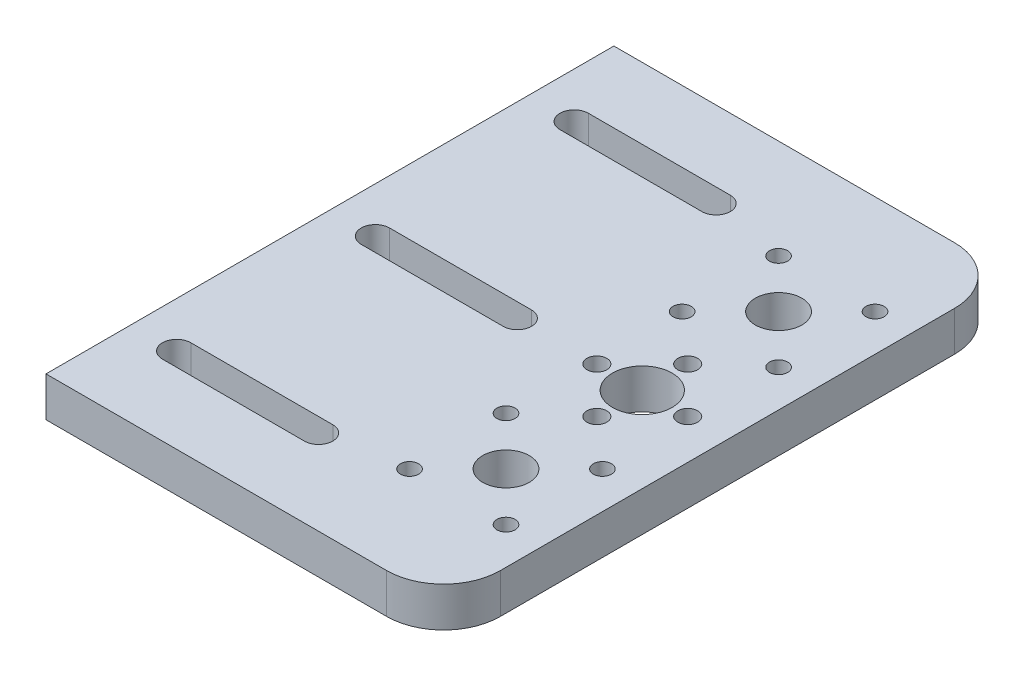
ISO-10303-21;
HEADER;
FILE_DESCRIPTION(('STEP AP214'),'2;1');
FILE_NAME('part.step','',(''),(''),'','','');
FILE_SCHEMA(('AUTOMOTIVE_DESIGN { 1 0 10303 214 1 1 1 1 }'));
ENDSEC;
DATA;
#1=APPLICATION_CONTEXT('core data for automotive mechanical design processes');
#2=APPLICATION_PROTOCOL_DEFINITION('international standard','automotive_design',2000,#1);
#3=PRODUCT_CONTEXT('',#1,'mechanical');
#4=PRODUCT('Part','Part','',(#3));
#5=PRODUCT_RELATED_PRODUCT_CATEGORY('part','',(#4));
#6=PRODUCT_DEFINITION_FORMATION('','',#4);
#7=PRODUCT_DEFINITION_CONTEXT('part definition',#1,'design');
#8=PRODUCT_DEFINITION('design','',#6,#7);
#9=PRODUCT_DEFINITION_SHAPE('','',#8);
#10=(LENGTH_UNIT() NAMED_UNIT(*) SI_UNIT(.MILLI.,.METRE.));
#11=(NAMED_UNIT(*) PLANE_ANGLE_UNIT() SI_UNIT($,.RADIAN.));
#12=(NAMED_UNIT(*) SI_UNIT($,.STERADIAN.) SOLID_ANGLE_UNIT());
#13=UNCERTAINTY_MEASURE_WITH_UNIT(LENGTH_MEASURE(1.E-05),#10,'distance_accuracy_value','');
#14=(GEOMETRIC_REPRESENTATION_CONTEXT(3) GLOBAL_UNCERTAINTY_ASSIGNED_CONTEXT((#13)) GLOBAL_UNIT_ASSIGNED_CONTEXT((#10,
#11,#12)) REPRESENTATION_CONTEXT('',''));
#15=CARTESIAN_POINT('',(0.,0.,0.));
#16=DIRECTION('',(0.,0.,1.));
#17=DIRECTION('',(1.,0.,0.));
#18=AXIS2_PLACEMENT_3D('',#15,#16,#17);
#19=CARTESIAN_POINT('',(0.,7.,-17.5));
#20=DIRECTION('',(0.,0.,-1.));
#21=DIRECTION('',(-1.,0.,0.));
#22=AXIS2_PLACEMENT_3D('',#19,#20,#21);
#23=PLANE('',#22);
#24=DIRECTION('',(1.,0.,0.));
#25=VECTOR('',#24,1.);
#26=CARTESIAN_POINT('',(0.,0.,-17.5));
#27=LINE('',#26,#25);
#28=CARTESIAN_POINT('',(7.99999999999999,0.,-17.5));
#29=VERTEX_POINT('',#28);
#30=CARTESIAN_POINT('',(33.,0.,-17.5));
#31=VERTEX_POINT('',#30);
#32=EDGE_CURVE('E334',#29,#31,#27,.T.);
#33=ORIENTED_EDGE('',*,*,#32,.T.);
#34=DIRECTION('',(0.,-1.,0.));
#35=VECTOR('',#34,1.);
#36=CARTESIAN_POINT('',(33.,7.,-17.5));
#37=LINE('',#36,#35);
#38=CARTESIAN_POINT('',(33.,7.,-17.5));
#39=VERTEX_POINT('',#38);
#40=EDGE_CURVE('E354',#39,#31,#37,.T.);
#41=ORIENTED_EDGE('',*,*,#40,.F.);
#42=DIRECTION('',(1.,0.,0.));
#43=VECTOR('',#42,1.);
#44=CARTESIAN_POINT('',(0.,7.,-17.5));
#45=LINE('',#44,#43);
#46=CARTESIAN_POINT('',(7.99999999999999,7.,-17.5));
#47=VERTEX_POINT('',#46);
#48=EDGE_CURVE('E247',#47,#39,#45,.T.);
#49=ORIENTED_EDGE('',*,*,#48,.F.);
#50=DIRECTION('',(0.,-1.,0.));
#51=VECTOR('',#50,1.);
#52=CARTESIAN_POINT('',(7.99999999999999,7.,-17.5));
#53=LINE('',#52,#51);
#54=EDGE_CURVE('E346',#47,#29,#53,.T.);
#55=ORIENTED_EDGE('',*,*,#54,.T.);
#56=EDGE_LOOP('',(#33,#41,#49,#55));
#57=FACE_BOUND('',#56,.T.);
#58=ADVANCED_FACE('F41',(#57),#23,.F.);
#59=CARTESIAN_POINT('',(33.,7.,-15.));
#60=DIRECTION('',(0.,-1.,0.));
#61=DIRECTION('',(0.,0.,-1.));
#62=AXIS2_PLACEMENT_3D('',#59,#60,#61);
#63=CYLINDRICAL_SURFACE('',#62,2.5);
#64=CARTESIAN_POINT('',(33.,0.,-15.));
#65=DIRECTION('',(0.,1.,0.));
#66=DIRECTION('',(0.,0.,1.));
#67=AXIS2_PLACEMENT_3D('',#64,#65,#66);
#68=CIRCLE('',#67,2.5);
#69=CARTESIAN_POINT('',(33.,0.,-12.5));
#70=VERTEX_POINT('',#69);
#71=EDGE_CURVE('E337',#31,#70,#68,.F.);
#72=ORIENTED_EDGE('',*,*,#71,.T.);
#73=DIRECTION('',(0.,-1.,0.));
#74=VECTOR('',#73,1.);
#75=CARTESIAN_POINT('',(33.,7.,-12.5));
#76=LINE('',#75,#74);
#77=CARTESIAN_POINT('',(33.,7.,-12.5));
#78=VERTEX_POINT('',#77);
#79=EDGE_CURVE('E352',#78,#70,#76,.T.);
#80=ORIENTED_EDGE('',*,*,#79,.F.);
#81=CARTESIAN_POINT('',(33.,7.,-15.));
#82=DIRECTION('',(0.,1.,0.));
#83=DIRECTION('',(0.,0.,1.));
#84=AXIS2_PLACEMENT_3D('',#81,#82,#83);
#85=CIRCLE('',#84,2.5);
#86=EDGE_CURVE('E250',#39,#78,#85,.F.);
#87=ORIENTED_EDGE('',*,*,#86,.F.);
#88=ORIENTED_EDGE('',*,*,#40,.T.);
#89=EDGE_LOOP('',(#72,#80,#87,#88));
#90=FACE_BOUND('',#89,.T.);
#91=ADVANCED_FACE('F445',(#90),#63,.F.);
#92=CARTESIAN_POINT('',(0.,7.,-12.5));
#93=DIRECTION('',(0.,0.,-1.));
#94=DIRECTION('',(-1.,0.,0.));
#95=AXIS2_PLACEMENT_3D('',#92,#93,#94);
#96=PLANE('',#95);
#97=DIRECTION('',(1.,0.,0.));
#98=VECTOR('',#97,1.);
#99=CARTESIAN_POINT('',(0.,0.,-12.5));
#100=LINE('',#99,#98);
#101=CARTESIAN_POINT('',(7.99999999999999,0.,-12.5));
#102=VERTEX_POINT('',#101);
#103=EDGE_CURVE('E340',#102,#70,#100,.T.);
#104=ORIENTED_EDGE('',*,*,#103,.F.);
#105=DIRECTION('',(0.,-1.,0.));
#106=VECTOR('',#105,1.);
#107=CARTESIAN_POINT('',(7.99999999999999,7.,-12.5));
#108=LINE('',#107,#106);
#109=CARTESIAN_POINT('',(7.99999999999999,7.,-12.5));
#110=VERTEX_POINT('',#109);
#111=EDGE_CURVE('E349',#110,#102,#108,.T.);
#112=ORIENTED_EDGE('',*,*,#111,.F.);
#113=DIRECTION('',(1.,0.,0.));
#114=VECTOR('',#113,1.);
#115=CARTESIAN_POINT('',(0.,7.,-12.5));
#116=LINE('',#115,#114);
#117=EDGE_CURVE('E252',#110,#78,#116,.T.);
#118=ORIENTED_EDGE('',*,*,#117,.T.);
#119=ORIENTED_EDGE('',*,*,#79,.T.);
#120=EDGE_LOOP('',(#104,#112,#118,#119));
#121=FACE_BOUND('',#120,.T.);
#122=ADVANCED_FACE('F451',(#121),#96,.T.);
#123=CARTESIAN_POINT('',(33.,7.,-50.));
#124=DIRECTION('',(0.,-1.,0.));
#125=DIRECTION('',(0.,0.,-1.));
#126=AXIS2_PLACEMENT_3D('',#123,#124,#125);
#127=CYLINDRICAL_SURFACE('',#126,2.5);
#128=CARTESIAN_POINT('',(33.,0.,-50.));
#129=DIRECTION('',(0.,1.,0.));
#130=DIRECTION('',(0.,0.,1.));
#131=AXIS2_PLACEMENT_3D('',#128,#129,#130);
#132=CIRCLE('',#131,2.5);
#133=CARTESIAN_POINT('',(33.,0.,-47.5));
#134=VERTEX_POINT('',#133);
#135=CARTESIAN_POINT('',(33.,0.,-52.5));
#136=VERTEX_POINT('',#135);
#137=EDGE_CURVE('E295',#134,#136,#132,.T.);
#138=ORIENTED_EDGE('',*,*,#137,.F.);
#139=DIRECTION('',(0.,-1.,0.));
#140=VECTOR('',#139,1.);
#141=CARTESIAN_POINT('',(33.,7.,-47.5));
#142=LINE('',#141,#140);
#143=CARTESIAN_POINT('',(33.,7.,-47.5));
#144=VERTEX_POINT('',#143);
#145=EDGE_CURVE('E350',#144,#134,#142,.T.);
#146=ORIENTED_EDGE('',*,*,#145,.F.);
#147=CARTESIAN_POINT('',(33.,7.,-50.));
#148=DIRECTION('',(0.,1.,0.));
#149=DIRECTION('',(0.,0.,1.));
#150=AXIS2_PLACEMENT_3D('',#147,#148,#149);
#151=CIRCLE('',#150,2.5);
#152=CARTESIAN_POINT('',(33.,7.,-52.5));
#153=VERTEX_POINT('',#152);
#154=EDGE_CURVE('E209',#144,#153,#151,.T.);
#155=ORIENTED_EDGE('',*,*,#154,.T.);
#156=DIRECTION('',(0.,-1.,0.));
#157=VECTOR('',#156,1.);
#158=CARTESIAN_POINT('',(33.,7.,-52.5));
#159=LINE('',#158,#157);
#160=EDGE_CURVE('E358',#153,#136,#159,.T.);
#161=ORIENTED_EDGE('',*,*,#160,.T.);
#162=EDGE_LOOP('',(#138,#146,#155,#161));
#163=FACE_BOUND('',#162,.T.);
#164=ADVANCED_FACE('F505',(#163),#127,.F.);
#165=CARTESIAN_POINT('',(0.,7.,-47.5));
#166=DIRECTION('',(0.,0.,-1.));
#167=DIRECTION('',(-1.,0.,0.));
#168=AXIS2_PLACEMENT_3D('',#165,#166,#167);
#169=PLANE('',#168);
#170=DIRECTION('',(1.,0.,0.));
#171=VECTOR('',#170,1.);
#172=CARTESIAN_POINT('',(0.,0.,-47.5));
#173=LINE('',#172,#171);
#174=CARTESIAN_POINT('',(8.,0.,-47.5));
#175=VERTEX_POINT('',#174);
#176=EDGE_CURVE('E298',#175,#134,#173,.T.);
#177=ORIENTED_EDGE('',*,*,#176,.F.);
#178=DIRECTION('',(0.,-1.,0.));
#179=VECTOR('',#178,1.);
#180=CARTESIAN_POINT('',(8.,7.,-47.5));
#181=LINE('',#180,#179);
#182=CARTESIAN_POINT('',(8.,7.,-47.5));
#183=VERTEX_POINT('',#182);
#184=EDGE_CURVE('E363',#183,#175,#181,.T.);
#185=ORIENTED_EDGE('',*,*,#184,.F.);
#186=DIRECTION('',(1.,0.,0.));
#187=VECTOR('',#186,1.);
#188=CARTESIAN_POINT('',(0.,7.,-47.5));
#189=LINE('',#188,#187);
#190=EDGE_CURVE('E212',#183,#144,#189,.T.);
#191=ORIENTED_EDGE('',*,*,#190,.T.);
#192=ORIENTED_EDGE('',*,*,#145,.T.);
#193=EDGE_LOOP('',(#177,#185,#191,#192));
#194=FACE_BOUND('',#193,.T.);
#195=ADVANCED_FACE('F501',(#194),#169,.T.);
#196=CARTESIAN_POINT('',(8.,7.,-50.));
#197=DIRECTION('',(0.,-1.,0.));
#198=DIRECTION('',(0.,0.,-1.));
#199=AXIS2_PLACEMENT_3D('',#196,#197,#198);
#200=CYLINDRICAL_SURFACE('',#199,2.5);
#201=CARTESIAN_POINT('',(8.,0.,-50.));
#202=DIRECTION('',(0.,1.,0.));
#203=DIRECTION('',(0.,0.,1.));
#204=AXIS2_PLACEMENT_3D('',#201,#202,#203);
#205=CIRCLE('',#204,2.5);
#206=CARTESIAN_POINT('',(8.,0.,-52.5));
#207=VERTEX_POINT('',#206);
#208=EDGE_CURVE('E301',#207,#175,#205,.T.);
#209=ORIENTED_EDGE('',*,*,#208,.F.);
#210=DIRECTION('',(0.,-1.,0.));
#211=VECTOR('',#210,1.);
#212=CARTESIAN_POINT('',(8.,7.,-52.5));
#213=LINE('',#212,#211);
#214=CARTESIAN_POINT('',(8.,7.,-52.5));
#215=VERTEX_POINT('',#214);
#216=EDGE_CURVE('E360',#215,#207,#213,.T.);
#217=ORIENTED_EDGE('',*,*,#216,.F.);
#218=CARTESIAN_POINT('',(8.,7.,-50.));
#219=DIRECTION('',(0.,1.,0.));
#220=DIRECTION('',(0.,0.,1.));
#221=AXIS2_PLACEMENT_3D('',#218,#219,#220);
#222=CIRCLE('',#221,2.5);
#223=EDGE_CURVE('E215',#215,#183,#222,.T.);
#224=ORIENTED_EDGE('',*,*,#223,.T.);
#225=ORIENTED_EDGE('',*,*,#184,.T.);
#226=EDGE_LOOP('',(#209,#217,#224,#225));
#227=FACE_BOUND('',#226,.T.);
#228=ADVANCED_FACE('F497',(#227),#200,.F.);
#229=CARTESIAN_POINT('',(33.,7.,-85.));
#230=DIRECTION('',(0.,-1.,0.));
#231=DIRECTION('',(0.,0.,-1.));
#232=AXIS2_PLACEMENT_3D('',#229,#230,#231);
#233=CYLINDRICAL_SURFACE('',#232,2.5);
#234=CARTESIAN_POINT('',(33.,0.,-85.));
#235=DIRECTION('',(0.,1.,0.));
#236=DIRECTION('',(0.,0.,1.));
#237=AXIS2_PLACEMENT_3D('',#234,#235,#236);
#238=CIRCLE('',#237,2.5);
#239=CARTESIAN_POINT('',(33.,0.,-82.5));
#240=VERTEX_POINT('',#239);
#241=CARTESIAN_POINT('',(33.,0.,-87.5));
#242=VERTEX_POINT('',#241);
#243=EDGE_CURVE('E283',#240,#242,#238,.T.);
#244=ORIENTED_EDGE('',*,*,#243,.F.);
#245=DIRECTION('',(0.,-1.,0.));
#246=VECTOR('',#245,1.);
#247=CARTESIAN_POINT('',(33.,7.,-82.5));
#248=LINE('',#247,#246);
#249=CARTESIAN_POINT('',(33.,7.,-82.5));
#250=VERTEX_POINT('',#249);
#251=EDGE_CURVE('E361',#250,#240,#248,.T.);
#252=ORIENTED_EDGE('',*,*,#251,.F.);
#253=CARTESIAN_POINT('',(33.,7.,-85.));
#254=DIRECTION('',(0.,1.,0.));
#255=DIRECTION('',(0.,0.,1.));
#256=AXIS2_PLACEMENT_3D('',#253,#254,#255);
#257=CIRCLE('',#256,2.5);
#258=CARTESIAN_POINT('',(33.,7.,-87.5));
#259=VERTEX_POINT('',#258);
#260=EDGE_CURVE('E198',#250,#259,#257,.T.);
#261=ORIENTED_EDGE('',*,*,#260,.T.);
#262=DIRECTION('',(0.,-1.,0.));
#263=VECTOR('',#262,1.);
#264=CARTESIAN_POINT('',(33.,7.,-87.5));
#265=LINE('',#264,#263);
#266=EDGE_CURVE('E179',#259,#242,#265,.T.);
#267=ORIENTED_EDGE('',*,*,#266,.T.);
#268=EDGE_LOOP('',(#244,#252,#261,#267));
#269=FACE_BOUND('',#268,.T.);
#270=ADVANCED_FACE('F500',(#269),#233,.F.);
#271=CARTESIAN_POINT('',(0.,7.,-82.5));
#272=DIRECTION('',(0.,0.,-1.));
#273=DIRECTION('',(-1.,0.,0.));
#274=AXIS2_PLACEMENT_3D('',#271,#272,#273);
#275=PLANE('',#274);
#276=DIRECTION('',(1.,0.,0.));
#277=VECTOR('',#276,1.);
#278=CARTESIAN_POINT('',(0.,0.,-82.5));
#279=LINE('',#278,#277);
#280=CARTESIAN_POINT('',(7.99999999999999,0.,-82.5));
#281=VERTEX_POINT('',#280);
#282=EDGE_CURVE('E286',#281,#240,#279,.T.);
#283=ORIENTED_EDGE('',*,*,#282,.F.);
#284=DIRECTION('',(0.,-1.,0.));
#285=VECTOR('',#284,1.);
#286=CARTESIAN_POINT('',(7.99999999999999,7.,-82.5));
#287=LINE('',#286,#285);
#288=CARTESIAN_POINT('',(7.99999999999999,7.,-82.5));
#289=VERTEX_POINT('',#288);
#290=EDGE_CURVE('E369',#289,#281,#287,.T.);
#291=ORIENTED_EDGE('',*,*,#290,.F.);
#292=DIRECTION('',(1.,0.,0.));
#293=VECTOR('',#292,1.);
#294=CARTESIAN_POINT('',(0.,7.,-82.5));
#295=LINE('',#294,#293);
#296=EDGE_CURVE('E201',#289,#250,#295,.T.);
#297=ORIENTED_EDGE('',*,*,#296,.T.);
#298=ORIENTED_EDGE('',*,*,#251,.T.);
#299=EDGE_LOOP('',(#283,#291,#297,#298));
#300=FACE_BOUND('',#299,.T.);
#301=ADVANCED_FACE('F517',(#300),#275,.T.);
#302=CARTESIAN_POINT('',(8.,7.,-85.));
#303=DIRECTION('',(0.,-1.,0.));
#304=DIRECTION('',(0.,0.,-1.));
#305=AXIS2_PLACEMENT_3D('',#302,#303,#304);
#306=CYLINDRICAL_SURFACE('',#305,2.5);
#307=CARTESIAN_POINT('',(8.,0.,-85.));
#308=DIRECTION('',(0.,1.,0.));
#309=DIRECTION('',(0.,0.,1.));
#310=AXIS2_PLACEMENT_3D('',#307,#308,#309);
#311=CIRCLE('',#310,2.5);
#312=CARTESIAN_POINT('',(7.99999999999999,0.,-87.5));
#313=VERTEX_POINT('',#312);
#314=EDGE_CURVE('E289',#313,#281,#311,.T.);
#315=ORIENTED_EDGE('',*,*,#314,.F.);
#316=DIRECTION('',(0.,-1.,0.));
#317=VECTOR('',#316,1.);
#318=CARTESIAN_POINT('',(7.99999999999999,7.,-87.5));
#319=LINE('',#318,#317);
#320=CARTESIAN_POINT('',(7.99999999999999,7.,-87.5));
#321=VERTEX_POINT('',#320);
#322=EDGE_CURVE('E367',#321,#313,#319,.T.);
#323=ORIENTED_EDGE('',*,*,#322,.F.);
#324=CARTESIAN_POINT('',(8.,7.,-85.));
#325=DIRECTION('',(0.,1.,0.));
#326=DIRECTION('',(0.,0.,1.));
#327=AXIS2_PLACEMENT_3D('',#324,#325,#326);
#328=CIRCLE('',#327,2.5);
#329=EDGE_CURVE('E204',#321,#289,#328,.T.);
#330=ORIENTED_EDGE('',*,*,#329,.T.);
#331=ORIENTED_EDGE('',*,*,#290,.T.);
#332=EDGE_LOOP('',(#315,#323,#330,#331));
#333=FACE_BOUND('',#332,.T.);
#334=ADVANCED_FACE('F514',(#333),#306,.F.);
#335=CARTESIAN_POINT('',(0.,7.,0.));
#336=DIRECTION('',(0.,0.,-1.));
#337=DIRECTION('',(-1.,0.,0.));
#338=AXIS2_PLACEMENT_3D('',#335,#336,#337);
#339=PLANE('',#338);
#340=DIRECTION('',(1.,0.,0.));
#341=VECTOR('',#340,1.);
#342=CARTESIAN_POINT('',(0.,0.,0.));
#343=LINE('',#342,#341);
#344=CARTESIAN_POINT('',(0.,0.,0.));
#345=VERTEX_POINT('',#344);
#346=CARTESIAN_POINT('',(60.,0.,0.));
#347=VERTEX_POINT('',#346);
#348=EDGE_CURVE('E269',#345,#347,#343,.T.);
#349=ORIENTED_EDGE('',*,*,#348,.T.);
#350=DIRECTION('',(0.,-1.,0.));
#351=VECTOR('',#350,1.);
#352=CARTESIAN_POINT('',(60.,7.,0.));
#353=LINE('',#352,#351);
#354=CARTESIAN_POINT('',(60.,7.,0.));
#355=VERTEX_POINT('',#354);
#356=EDGE_CURVE('E64',#347,#355,#353,.F.);
#357=ORIENTED_EDGE('',*,*,#356,.T.);
#358=DIRECTION('',(1.,0.,0.));
#359=VECTOR('',#358,1.);
#360=CARTESIAN_POINT('',(0.,7.,0.));
#361=LINE('',#360,#359);
#362=CARTESIAN_POINT('',(0.,7.,0.));
#363=VERTEX_POINT('',#362);
#364=EDGE_CURVE('E384',#363,#355,#361,.T.);
#365=ORIENTED_EDGE('',*,*,#364,.F.);
#366=DIRECTION('',(0.,-1.,0.));
#367=VECTOR('',#366,1.);
#368=CARTESIAN_POINT('',(0.,7.,0.));
#369=LINE('',#368,#367);
#370=EDGE_CURVE('E180',#363,#345,#369,.T.);
#371=ORIENTED_EDGE('',*,*,#370,.T.);
#372=EDGE_LOOP('',(#349,#357,#365,#371));
#373=FACE_BOUND('',#372,.T.);
#374=ADVANCED_FACE('F396',(#373),#339,.F.);
#375=CARTESIAN_POINT('',(70.,7.,0.));
#376=DIRECTION('',(-1.,0.,0.));
#377=DIRECTION('',(0.,0.,1.));
#378=AXIS2_PLACEMENT_3D('',#375,#376,#377);
#379=PLANE('',#378);
#380=DIRECTION('',(0.,0.,-1.));
#381=VECTOR('',#380,1.);
#382=CARTESIAN_POINT('',(70.,7.,0.));
#383=LINE('',#382,#381);
#384=CARTESIAN_POINT('',(70.,7.,-10.));
#385=VERTEX_POINT('',#384);
#386=CARTESIAN_POINT('',(70.,7.,-90.));
#387=VERTEX_POINT('',#386);
#388=EDGE_CURVE('E186',#385,#387,#383,.T.);
#389=ORIENTED_EDGE('',*,*,#388,.F.);
#390=DIRECTION('',(0.,-1.,0.));
#391=VECTOR('',#390,1.);
#392=CARTESIAN_POINT('',(70.,7.,-10.));
#393=LINE('',#392,#391);
#394=CARTESIAN_POINT('',(70.,0.,-10.));
#395=VERTEX_POINT('',#394);
#396=EDGE_CURVE('E374',#385,#395,#393,.T.);
#397=ORIENTED_EDGE('',*,*,#396,.T.);
#398=DIRECTION('',(0.,0.,-1.));
#399=VECTOR('',#398,1.);
#400=CARTESIAN_POINT('',(70.,0.,0.));
#401=LINE('',#400,#399);
#402=CARTESIAN_POINT('',(70.,0.,-90.));
#403=VERTEX_POINT('',#402);
#404=EDGE_CURVE('E271',#395,#403,#401,.T.);
#405=ORIENTED_EDGE('',*,*,#404,.T.);
#406=DIRECTION('',(0.,-1.,0.));
#407=VECTOR('',#406,1.);
#408=CARTESIAN_POINT('',(70.,7.,-90.));
#409=LINE('',#408,#407);
#410=EDGE_CURVE('E357',#403,#387,#409,.F.);
#411=ORIENTED_EDGE('',*,*,#410,.T.);
#412=EDGE_LOOP('',(#389,#397,#405,#411));
#413=FACE_BOUND('',#412,.T.);
#414=ADVANCED_FACE('F388',(#413),#379,.F.);
#415=CARTESIAN_POINT('',(0.,7.,-100.));
#416=DIRECTION('',(0.,0.,-1.));
#417=DIRECTION('',(-1.,0.,0.));
#418=AXIS2_PLACEMENT_3D('',#415,#416,#417);
#419=PLANE('',#418);
#420=DIRECTION('',(1.,0.,0.));
#421=VECTOR('',#420,1.);
#422=CARTESIAN_POINT('',(0.,7.,-100.));
#423=LINE('',#422,#421);
#424=CARTESIAN_POINT('',(0.,7.,-100.));
#425=VERTEX_POINT('',#424);
#426=CARTESIAN_POINT('',(60.,7.,-100.));
#427=VERTEX_POINT('',#426);
#428=EDGE_CURVE('E171',#425,#427,#423,.T.);
#429=ORIENTED_EDGE('',*,*,#428,.T.);
#430=DIRECTION('',(0.,-1.,0.));
#431=VECTOR('',#430,1.);
#432=CARTESIAN_POINT('',(60.,0.,-100.));
#433=LINE('',#432,#431);
#434=CARTESIAN_POINT('',(60.,0.,-100.));
#435=VERTEX_POINT('',#434);
#436=EDGE_CURVE('E11',#427,#435,#433,.T.);
#437=ORIENTED_EDGE('',*,*,#436,.T.);
#438=DIRECTION('',(1.,0.,0.));
#439=VECTOR('',#438,1.);
#440=CARTESIAN_POINT('',(0.,0.,-100.));
#441=LINE('',#440,#439);
#442=CARTESIAN_POINT('',(0.,0.,-100.));
#443=VERTEX_POINT('',#442);
#444=EDGE_CURVE('E174',#443,#435,#441,.T.);
#445=ORIENTED_EDGE('',*,*,#444,.F.);
#446=DIRECTION('',(0.,-1.,0.));
#447=VECTOR('',#446,1.);
#448=CARTESIAN_POINT('',(0.,7.,-100.));
#449=LINE('',#448,#447);
#450=EDGE_CURVE('E169',#425,#443,#449,.T.);
#451=ORIENTED_EDGE('',*,*,#450,.F.);
#452=EDGE_LOOP('',(#429,#437,#445,#451));
#453=FACE_BOUND('',#452,.T.);
#454=ADVANCED_FACE('F170',(#453),#419,.T.);
#455=CARTESIAN_POINT('',(55.,7.,-26.));
#456=DIRECTION('',(0.,-1.,0.));
#457=DIRECTION('',(0.,0.,-1.));
#458=AXIS2_PLACEMENT_3D('',#455,#456,#457);
#459=CYLINDRICAL_SURFACE('',#458,4.1);
#460=CARTESIAN_POINT('',(55.,7.,-26.));
#461=DIRECTION('',(0.,1.,0.));
#462=DIRECTION('',(0.,0.,1.));
#463=AXIS2_PLACEMENT_3D('',#460,#461,#462);
#464=CIRCLE('',#463,4.1);
#465=CARTESIAN_POINT('',(55.,7.,-21.9));
#466=VERTEX_POINT('',#465);
#467=EDGE_CURVE('E244',#466,#466,#464,.F.);
#468=ORIENTED_EDGE('',*,*,#467,.F.);
#469=EDGE_LOOP('',(#468));
#470=FACE_BOUND('',#469,.T.);
#471=CARTESIAN_POINT('',(55.,0.,-26.));
#472=DIRECTION('',(0.,1.,0.));
#473=DIRECTION('',(0.,0.,1.));
#474=AXIS2_PLACEMENT_3D('',#471,#472,#473);
#475=CIRCLE('',#474,4.1);
#476=CARTESIAN_POINT('',(55.,0.,-21.9));
#477=VERTEX_POINT('',#476);
#478=EDGE_CURVE('E331',#477,#477,#475,.F.);
#479=ORIENTED_EDGE('',*,*,#478,.T.);
#480=EDGE_LOOP('',(#479));
#481=FACE_BOUND('',#480,.T.);
#482=ADVANCED_FACE('F456',(#470,#481),#459,.F.);
#483=CARTESIAN_POINT('',(46.51,7.,-17.51));
#484=DIRECTION('',(0.,-1.,0.));
#485=DIRECTION('',(0.,0.,-1.));
#486=AXIS2_PLACEMENT_3D('',#483,#484,#485);
#487=CYLINDRICAL_SURFACE('',#486,1.60000000000001);
#488=CARTESIAN_POINT('',(46.51,7.,-17.51));
#489=DIRECTION('',(0.,1.,0.));
#490=DIRECTION('',(0.,0.,1.));
#491=AXIS2_PLACEMENT_3D('',#488,#489,#490);
#492=CIRCLE('',#491,1.60000000000001);
#493=CARTESIAN_POINT('',(46.51,7.,-15.91));
#494=VERTEX_POINT('',#493);
#495=EDGE_CURVE('E241',#494,#494,#492,.F.);
#496=ORIENTED_EDGE('',*,*,#495,.F.);
#497=EDGE_LOOP('',(#496));
#498=FACE_BOUND('',#497,.T.);
#499=CARTESIAN_POINT('',(46.51,0.,-17.51));
#500=DIRECTION('',(0.,1.,0.));
#501=DIRECTION('',(0.,0.,1.));
#502=AXIS2_PLACEMENT_3D('',#499,#500,#501);
#503=CIRCLE('',#502,1.60000000000001);
#504=CARTESIAN_POINT('',(46.51,0.,-15.91));
#505=VERTEX_POINT('',#504);
#506=EDGE_CURVE('E328',#505,#505,#503,.F.);
#507=ORIENTED_EDGE('',*,*,#506,.T.);
#508=EDGE_LOOP('',(#507));
#509=FACE_BOUND('',#508,.T.);
#510=ADVANCED_FACE('F459',(#498,#509),#487,.F.);
#511=CARTESIAN_POINT('',(63.49,7.,-34.49));
#512=DIRECTION('',(0.,-1.,0.));
#513=DIRECTION('',(0.,0.,-1.));
#514=AXIS2_PLACEMENT_3D('',#511,#512,#513);
#515=CYLINDRICAL_SURFACE('',#514,1.60000000000002);
#516=CARTESIAN_POINT('',(63.49,7.,-34.49));
#517=DIRECTION('',(0.,1.,0.));
#518=DIRECTION('',(0.,0.,1.));
#519=AXIS2_PLACEMENT_3D('',#516,#517,#518);
#520=CIRCLE('',#519,1.60000000000002);
#521=CARTESIAN_POINT('',(63.49,7.,-32.89));
#522=VERTEX_POINT('',#521);
#523=EDGE_CURVE('E238',#522,#522,#520,.T.);
#524=ORIENTED_EDGE('',*,*,#523,.T.);
#525=EDGE_LOOP('',(#524));
#526=FACE_BOUND('',#525,.T.);
#527=CARTESIAN_POINT('',(63.49,0.,-34.49));
#528=DIRECTION('',(0.,1.,0.));
#529=DIRECTION('',(0.,0.,1.));
#530=AXIS2_PLACEMENT_3D('',#527,#528,#529);
#531=CIRCLE('',#530,1.60000000000002);
#532=CARTESIAN_POINT('',(63.49,0.,-32.89));
#533=VERTEX_POINT('',#532);
#534=EDGE_CURVE('E325',#533,#533,#531,.T.);
#535=ORIENTED_EDGE('',*,*,#534,.F.);
#536=EDGE_LOOP('',(#535));
#537=FACE_BOUND('',#536,.T.);
#538=ADVANCED_FACE('F463',(#526,#537),#515,.F.);
#539=CARTESIAN_POINT('',(46.51,7.,-65.51));
#540=DIRECTION('',(0.,-1.,0.));
#541=DIRECTION('',(0.,0.,-1.));
#542=AXIS2_PLACEMENT_3D('',#539,#540,#541);
#543=CYLINDRICAL_SURFACE('',#542,1.60000000000001);
#544=CARTESIAN_POINT('',(46.51,7.,-65.51));
#545=DIRECTION('',(0.,1.,0.));
#546=DIRECTION('',(0.,0.,1.));
#547=AXIS2_PLACEMENT_3D('',#544,#545,#546);
#548=CIRCLE('',#547,1.60000000000001);
#549=CARTESIAN_POINT('',(46.51,7.,-63.91));
#550=VERTEX_POINT('',#549);
#551=EDGE_CURVE('E235',#550,#550,#548,.F.);
#552=ORIENTED_EDGE('',*,*,#551,.F.);
#553=EDGE_LOOP('',(#552));
#554=FACE_BOUND('',#553,.T.);
#555=CARTESIAN_POINT('',(46.51,0.,-65.51));
#556=DIRECTION('',(0.,1.,0.));
#557=DIRECTION('',(0.,0.,1.));
#558=AXIS2_PLACEMENT_3D('',#555,#556,#557);
#559=CIRCLE('',#558,1.60000000000001);
#560=CARTESIAN_POINT('',(46.51,0.,-63.91));
#561=VERTEX_POINT('',#560);
#562=EDGE_CURVE('E322',#561,#561,#559,.F.);
#563=ORIENTED_EDGE('',*,*,#562,.T.);
#564=EDGE_LOOP('',(#563));
#565=FACE_BOUND('',#564,.T.);
#566=ADVANCED_FACE('F467',(#554,#565),#543,.F.);
#567=CARTESIAN_POINT('',(63.49,7.,-82.49));
#568=DIRECTION('',(0.,-1.,0.));
#569=DIRECTION('',(0.,0.,-1.));
#570=AXIS2_PLACEMENT_3D('',#567,#568,#569);
#571=CYLINDRICAL_SURFACE('',#570,1.59999999999999);
#572=CARTESIAN_POINT('',(63.49,7.,-82.49));
#573=DIRECTION('',(0.,1.,0.));
#574=DIRECTION('',(0.,0.,1.));
#575=AXIS2_PLACEMENT_3D('',#572,#573,#574);
#576=CIRCLE('',#575,1.59999999999999);
#577=CARTESIAN_POINT('',(63.49,7.,-80.89));
#578=VERTEX_POINT('',#577);
#579=EDGE_CURVE('E232',#578,#578,#576,.T.);
#580=ORIENTED_EDGE('',*,*,#579,.T.);
#581=EDGE_LOOP('',(#580));
#582=FACE_BOUND('',#581,.T.);
#583=CARTESIAN_POINT('',(63.49,0.,-82.49));
#584=DIRECTION('',(0.,1.,0.));
#585=DIRECTION('',(0.,0.,1.));
#586=AXIS2_PLACEMENT_3D('',#583,#584,#585);
#587=CIRCLE('',#586,1.59999999999999);
#588=CARTESIAN_POINT('',(63.49,0.,-80.89));
#589=VERTEX_POINT('',#588);
#590=EDGE_CURVE('E319',#589,#589,#587,.T.);
#591=ORIENTED_EDGE('',*,*,#590,.F.);
#592=EDGE_LOOP('',(#591));
#593=FACE_BOUND('',#592,.T.);
#594=ADVANCED_FACE('F471',(#582,#593),#571,.F.);
#595=CARTESIAN_POINT('',(55.,7.,-42.));
#596=DIRECTION('',(0.,-1.,0.));
#597=DIRECTION('',(0.,0.,-1.));
#598=AXIS2_PLACEMENT_3D('',#595,#596,#597);
#599=CYLINDRICAL_SURFACE('',#598,1.75000000000001);
#600=CARTESIAN_POINT('',(55.,7.,-42.));
#601=DIRECTION('',(0.,1.,0.));
#602=DIRECTION('',(0.,0.,1.));
#603=AXIS2_PLACEMENT_3D('',#600,#601,#602);
#604=CIRCLE('',#603,1.75000000000001);
#605=CARTESIAN_POINT('',(55.,7.,-40.25));
#606=VERTEX_POINT('',#605);
#607=EDGE_CURVE('E229',#606,#606,#604,.T.);
#608=ORIENTED_EDGE('',*,*,#607,.T.);
#609=EDGE_LOOP('',(#608));
#610=FACE_BOUND('',#609,.T.);
#611=CARTESIAN_POINT('',(55.,0.,-42.));
#612=DIRECTION('',(0.,1.,0.));
#613=DIRECTION('',(0.,0.,1.));
#614=AXIS2_PLACEMENT_3D('',#611,#612,#613);
#615=CIRCLE('',#614,1.75000000000001);
#616=CARTESIAN_POINT('',(55.,0.,-40.25));
#617=VERTEX_POINT('',#616);
#618=EDGE_CURVE('E316',#617,#617,#615,.T.);
#619=ORIENTED_EDGE('',*,*,#618,.F.);
#620=EDGE_LOOP('',(#619));
#621=FACE_BOUND('',#620,.T.);
#622=ADVANCED_FACE('F475',(#610,#621),#599,.F.);
#623=CARTESIAN_POINT('',(63.,7.,-50.));
#624=DIRECTION('',(0.,-1.,0.));
#625=DIRECTION('',(0.,0.,-1.));
#626=AXIS2_PLACEMENT_3D('',#623,#624,#625);
#627=CYLINDRICAL_SURFACE('',#626,1.75000000000001);
#628=CARTESIAN_POINT('',(63.,7.,-50.));
#629=DIRECTION('',(0.,1.,0.));
#630=DIRECTION('',(0.,0.,1.));
#631=AXIS2_PLACEMENT_3D('',#628,#629,#630);
#632=CIRCLE('',#631,1.75000000000001);
#633=CARTESIAN_POINT('',(63.,7.,-48.25));
#634=VERTEX_POINT('',#633);
#635=EDGE_CURVE('E226',#634,#634,#632,.T.);
#636=ORIENTED_EDGE('',*,*,#635,.T.);
#637=EDGE_LOOP('',(#636));
#638=FACE_BOUND('',#637,.T.);
#639=CARTESIAN_POINT('',(63.,0.,-50.));
#640=DIRECTION('',(0.,1.,0.));
#641=DIRECTION('',(0.,0.,1.));
#642=AXIS2_PLACEMENT_3D('',#639,#640,#641);
#643=CIRCLE('',#642,1.75000000000001);
#644=CARTESIAN_POINT('',(63.,0.,-48.25));
#645=VERTEX_POINT('',#644);
#646=EDGE_CURVE('E313',#645,#645,#643,.T.);
#647=ORIENTED_EDGE('',*,*,#646,.F.);
#648=EDGE_LOOP('',(#647));
#649=FACE_BOUND('',#648,.T.);
#650=ADVANCED_FACE('F479',(#638,#649),#627,.F.);
#651=CARTESIAN_POINT('',(55.,7.,-58.));
#652=DIRECTION('',(0.,-1.,0.));
#653=DIRECTION('',(0.,0.,-1.));
#654=AXIS2_PLACEMENT_3D('',#651,#652,#653);
#655=CYLINDRICAL_SURFACE('',#654,1.75000000000001);
#656=CARTESIAN_POINT('',(55.,7.,-58.));
#657=DIRECTION('',(0.,1.,0.));
#658=DIRECTION('',(0.,0.,1.));
#659=AXIS2_PLACEMENT_3D('',#656,#657,#658);
#660=CIRCLE('',#659,1.75000000000001);
#661=CARTESIAN_POINT('',(55.,7.,-56.25));
#662=VERTEX_POINT('',#661);
#663=EDGE_CURVE('E223',#662,#662,#660,.T.);
#664=ORIENTED_EDGE('',*,*,#663,.T.);
#665=EDGE_LOOP('',(#664));
#666=FACE_BOUND('',#665,.T.);
#667=CARTESIAN_POINT('',(55.,0.,-58.));
#668=DIRECTION('',(0.,1.,0.));
#669=DIRECTION('',(0.,0.,1.));
#670=AXIS2_PLACEMENT_3D('',#667,#668,#669);
#671=CIRCLE('',#670,1.75000000000001);
#672=CARTESIAN_POINT('',(55.,0.,-56.25));
#673=VERTEX_POINT('',#672);
#674=EDGE_CURVE('E310',#673,#673,#671,.T.);
#675=ORIENTED_EDGE('',*,*,#674,.F.);
#676=EDGE_LOOP('',(#675));
#677=FACE_BOUND('',#676,.T.);
#678=ADVANCED_FACE('F483',(#666,#677),#655,.F.);
#679=CARTESIAN_POINT('',(47.,7.,-50.));
#680=DIRECTION('',(0.,-1.,0.));
#681=DIRECTION('',(0.,0.,-1.));
#682=AXIS2_PLACEMENT_3D('',#679,#680,#681);
#683=CYLINDRICAL_SURFACE('',#682,1.75);
#684=CARTESIAN_POINT('',(47.,7.,-50.));
#685=DIRECTION('',(0.,1.,0.));
#686=DIRECTION('',(0.,0.,1.));
#687=AXIS2_PLACEMENT_3D('',#684,#685,#686);
#688=CIRCLE('',#687,1.75);
#689=CARTESIAN_POINT('',(47.,7.,-48.25));
#690=VERTEX_POINT('',#689);
#691=EDGE_CURVE('E220',#690,#690,#688,.T.);
#692=ORIENTED_EDGE('',*,*,#691,.T.);
#693=EDGE_LOOP('',(#692));
#694=FACE_BOUND('',#693,.T.);
#695=CARTESIAN_POINT('',(47.,0.,-50.));
#696=DIRECTION('',(0.,1.,0.));
#697=DIRECTION('',(0.,0.,1.));
#698=AXIS2_PLACEMENT_3D('',#695,#696,#697);
#699=CIRCLE('',#698,1.75);
#700=CARTESIAN_POINT('',(47.,0.,-48.25));
#701=VERTEX_POINT('',#700);
#702=EDGE_CURVE('E307',#701,#701,#699,.T.);
#703=ORIENTED_EDGE('',*,*,#702,.F.);
#704=EDGE_LOOP('',(#703));
#705=FACE_BOUND('',#704,.T.);
#706=ADVANCED_FACE('F487',(#694,#705),#683,.F.);
#707=CARTESIAN_POINT('',(0.,7.,-52.5));
#708=DIRECTION('',(0.,0.,-1.));
#709=DIRECTION('',(-1.,0.,0.));
#710=AXIS2_PLACEMENT_3D('',#707,#708,#709);
#711=PLANE('',#710);
#712=DIRECTION('',(1.,0.,0.));
#713=VECTOR('',#712,1.);
#714=CARTESIAN_POINT('',(0.,0.,-52.5));
#715=LINE('',#714,#713);
#716=EDGE_CURVE('E304',#207,#136,#715,.T.);
#717=ORIENTED_EDGE('',*,*,#716,.T.);
#718=ORIENTED_EDGE('',*,*,#160,.F.);
#719=DIRECTION('',(1.,0.,0.));
#720=VECTOR('',#719,1.);
#721=CARTESIAN_POINT('',(0.,7.,-52.5));
#722=LINE('',#721,#720);
#723=EDGE_CURVE('E218',#215,#153,#722,.T.);
#724=ORIENTED_EDGE('',*,*,#723,.F.);
#725=ORIENTED_EDGE('',*,*,#216,.T.);
#726=EDGE_LOOP('',(#717,#718,#724,#725));
#727=FACE_BOUND('',#726,.T.);
#728=ADVANCED_FACE('F491',(#727),#711,.F.);
#729=CARTESIAN_POINT('',(0.,7.,-87.5));
#730=DIRECTION('',(0.,0.,-1.));
#731=DIRECTION('',(-1.,0.,0.));
#732=AXIS2_PLACEMENT_3D('',#729,#730,#731);
#733=PLANE('',#732);
#734=DIRECTION('',(1.,0.,0.));
#735=VECTOR('',#734,1.);
#736=CARTESIAN_POINT('',(0.,0.,-87.5));
#737=LINE('',#736,#735);
#738=EDGE_CURVE('E292',#313,#242,#737,.T.);
#739=ORIENTED_EDGE('',*,*,#738,.T.);
#740=ORIENTED_EDGE('',*,*,#266,.F.);
#741=DIRECTION('',(1.,0.,0.));
#742=VECTOR('',#741,1.);
#743=CARTESIAN_POINT('',(0.,7.,-87.5));
#744=LINE('',#743,#742);
#745=EDGE_CURVE('E207',#321,#259,#744,.T.);
#746=ORIENTED_EDGE('',*,*,#745,.F.);
#747=ORIENTED_EDGE('',*,*,#322,.T.);
#748=EDGE_LOOP('',(#739,#740,#746,#747));
#749=FACE_BOUND('',#748,.T.);
#750=ADVANCED_FACE('F495',(#749),#733,.F.);
#751=CARTESIAN_POINT('',(55.,7.,-74.));
#752=DIRECTION('',(0.,-1.,0.));
#753=DIRECTION('',(0.,0.,-1.));
#754=AXIS2_PLACEMENT_3D('',#751,#752,#753);
#755=CYLINDRICAL_SURFACE('',#754,4.09999999999997);
#756=CARTESIAN_POINT('',(55.,7.,-74.));
#757=DIRECTION('',(0.,1.,0.));
#758=DIRECTION('',(0.,0.,1.));
#759=AXIS2_PLACEMENT_3D('',#756,#757,#758);
#760=CIRCLE('',#759,4.09999999999997);
#761=CARTESIAN_POINT('',(55.,7.,-69.9));
#762=VERTEX_POINT('',#761);
#763=EDGE_CURVE('E192',#762,#762,#760,.T.);
#764=ORIENTED_EDGE('',*,*,#763,.T.);
#765=EDGE_LOOP('',(#764));
#766=FACE_BOUND('',#765,.T.);
#767=CARTESIAN_POINT('',(55.,0.,-74.));
#768=DIRECTION('',(0.,1.,0.));
#769=DIRECTION('',(0.,0.,1.));
#770=AXIS2_PLACEMENT_3D('',#767,#768,#769);
#771=CIRCLE('',#770,4.09999999999997);
#772=CARTESIAN_POINT('',(55.,0.,-69.9));
#773=VERTEX_POINT('',#772);
#774=EDGE_CURVE('E280',#773,#773,#771,.T.);
#775=ORIENTED_EDGE('',*,*,#774,.F.);
#776=EDGE_LOOP('',(#775));
#777=FACE_BOUND('',#776,.T.);
#778=ADVANCED_FACE('F512',(#766,#777),#755,.F.);
#779=CARTESIAN_POINT('',(55.,7.,-50.));
#780=DIRECTION('',(0.,-1.,0.));
#781=DIRECTION('',(0.,0.,-1.));
#782=AXIS2_PLACEMENT_3D('',#779,#780,#781);
#783=CYLINDRICAL_SURFACE('',#782,5.25);
#784=CARTESIAN_POINT('',(55.,7.,-50.));
#785=DIRECTION('',(0.,1.,0.));
#786=DIRECTION('',(0.,0.,1.));
#787=AXIS2_PLACEMENT_3D('',#784,#785,#786);
#788=CIRCLE('',#787,5.25);
#789=CARTESIAN_POINT('',(55.,7.,-44.75));
#790=VERTEX_POINT('',#789);
#791=EDGE_CURVE('E189',#790,#790,#788,.T.);
#792=ORIENTED_EDGE('',*,*,#791,.T.);
#793=EDGE_LOOP('',(#792));
#794=FACE_BOUND('',#793,.T.);
#795=CARTESIAN_POINT('',(55.,0.,-50.));
#796=DIRECTION('',(0.,1.,0.));
#797=DIRECTION('',(0.,0.,1.));
#798=AXIS2_PLACEMENT_3D('',#795,#796,#797);
#799=CIRCLE('',#798,5.25);
#800=CARTESIAN_POINT('',(55.,0.,-44.75));
#801=VERTEX_POINT('',#800);
#802=EDGE_CURVE('E277',#801,#801,#799,.T.);
#803=ORIENTED_EDGE('',*,*,#802,.F.);
#804=EDGE_LOOP('',(#803));
#805=FACE_BOUND('',#804,.T.);
#806=ADVANCED_FACE('F441',(#794,#805),#783,.F.);
#807=CARTESIAN_POINT('',(0.,7.,0.));
#808=DIRECTION('',(-1.,0.,0.));
#809=DIRECTION('',(0.,0.,1.));
#810=AXIS2_PLACEMENT_3D('',#807,#808,#809);
#811=PLANE('',#810);
#812=DIRECTION('',(0.,0.,-1.));
#813=VECTOR('',#812,1.);
#814=CARTESIAN_POINT('',(0.,0.,0.));
#815=LINE('',#814,#813);
#816=EDGE_CURVE('E275',#345,#443,#815,.T.);
#817=ORIENTED_EDGE('',*,*,#816,.F.);
#818=ORIENTED_EDGE('',*,*,#370,.F.);
#819=DIRECTION('',(0.,0.,-1.));
#820=VECTOR('',#819,1.);
#821=CARTESIAN_POINT('',(0.,7.,0.));
#822=LINE('',#821,#820);
#823=EDGE_CURVE('E185',#363,#425,#822,.T.);
#824=ORIENTED_EDGE('',*,*,#823,.T.);
#825=ORIENTED_EDGE('',*,*,#450,.T.);
#826=EDGE_LOOP('',(#817,#818,#824,#825));
#827=FACE_BOUND('',#826,.T.);
#828=ADVANCED_FACE('F188',(#827),#811,.T.);
#829=CARTESIAN_POINT('',(46.51,7.,-82.49));
#830=DIRECTION('',(0.,-1.,0.));
#831=DIRECTION('',(0.,0.,-1.));
#832=AXIS2_PLACEMENT_3D('',#829,#830,#831);
#833=CYLINDRICAL_SURFACE('',#832,1.60000000000001);
#834=CARTESIAN_POINT('',(46.51,7.,-82.49));
#835=DIRECTION('',(0.,1.,0.));
#836=DIRECTION('',(0.,0.,1.));
#837=AXIS2_PLACEMENT_3D('',#834,#835,#836);
#838=CIRCLE('',#837,1.60000000000001);
#839=CARTESIAN_POINT('',(46.51,7.,-80.89));
#840=VERTEX_POINT('',#839);
#841=EDGE_CURVE('E397',#840,#840,#838,.T.);
#842=ORIENTED_EDGE('',*,*,#841,.T.);
#843=EDGE_LOOP('',(#842));
#844=FACE_BOUND('',#843,.T.);
#845=CARTESIAN_POINT('',(46.51,0.,-82.49));
#846=DIRECTION('',(0.,1.,0.));
#847=DIRECTION('',(0.,0.,1.));
#848=AXIS2_PLACEMENT_3D('',#845,#846,#847);
#849=CIRCLE('',#848,1.60000000000001);
#850=CARTESIAN_POINT('',(46.51,0.,-80.89));
#851=VERTEX_POINT('',#850);
#852=EDGE_CURVE('E266',#851,#851,#849,.T.);
#853=ORIENTED_EDGE('',*,*,#852,.F.);
#854=EDGE_LOOP('',(#853));
#855=FACE_BOUND('',#854,.T.);
#856=ADVANCED_FACE('F430',(#844,#855),#833,.F.);
#857=CARTESIAN_POINT('',(63.49,7.,-65.51));
#858=DIRECTION('',(0.,-1.,0.));
#859=DIRECTION('',(0.,0.,-1.));
#860=AXIS2_PLACEMENT_3D('',#857,#858,#859);
#861=CYLINDRICAL_SURFACE('',#860,1.60000000000002);
#862=CARTESIAN_POINT('',(63.49,7.,-65.51));
#863=DIRECTION('',(0.,1.,0.));
#864=DIRECTION('',(0.,0.,1.));
#865=AXIS2_PLACEMENT_3D('',#862,#863,#864);
#866=CIRCLE('',#865,1.60000000000002);
#867=CARTESIAN_POINT('',(63.49,7.,-63.91));
#868=VERTEX_POINT('',#867);
#869=EDGE_CURVE('E400',#868,#868,#866,.F.);
#870=ORIENTED_EDGE('',*,*,#869,.F.);
#871=EDGE_LOOP('',(#870));
#872=FACE_BOUND('',#871,.T.);
#873=CARTESIAN_POINT('',(63.49,0.,-65.51));
#874=DIRECTION('',(0.,1.,0.));
#875=DIRECTION('',(0.,0.,1.));
#876=AXIS2_PLACEMENT_3D('',#873,#874,#875);
#877=CIRCLE('',#876,1.60000000000002);
#878=CARTESIAN_POINT('',(63.49,0.,-63.91));
#879=VERTEX_POINT('',#878);
#880=EDGE_CURVE('E263',#879,#879,#877,.F.);
#881=ORIENTED_EDGE('',*,*,#880,.T.);
#882=EDGE_LOOP('',(#881));
#883=FACE_BOUND('',#882,.T.);
#884=ADVANCED_FACE('F432',(#872,#883),#861,.F.);
#885=CARTESIAN_POINT('',(46.51,7.,-34.49));
#886=DIRECTION('',(0.,-1.,0.));
#887=DIRECTION('',(0.,0.,-1.));
#888=AXIS2_PLACEMENT_3D('',#885,#886,#887);
#889=CYLINDRICAL_SURFACE('',#888,1.60000000000001);
#890=CARTESIAN_POINT('',(46.51,7.,-34.49));
#891=DIRECTION('',(0.,1.,0.));
#892=DIRECTION('',(0.,0.,1.));
#893=AXIS2_PLACEMENT_3D('',#890,#891,#892);
#894=CIRCLE('',#893,1.60000000000001);
#895=CARTESIAN_POINT('',(46.51,7.,-32.89));
#896=VERTEX_POINT('',#895);
#897=EDGE_CURVE('E405',#896,#896,#894,.T.);
#898=ORIENTED_EDGE('',*,*,#897,.T.);
#899=EDGE_LOOP('',(#898));
#900=FACE_BOUND('',#899,.T.);
#901=CARTESIAN_POINT('',(46.51,0.,-34.49));
#902=DIRECTION('',(0.,1.,0.));
#903=DIRECTION('',(0.,0.,1.));
#904=AXIS2_PLACEMENT_3D('',#901,#902,#903);
#905=CIRCLE('',#904,1.60000000000001);
#906=CARTESIAN_POINT('',(46.51,0.,-32.89));
#907=VERTEX_POINT('',#906);
#908=EDGE_CURVE('E260',#907,#907,#905,.T.);
#909=ORIENTED_EDGE('',*,*,#908,.F.);
#910=EDGE_LOOP('',(#909));
#911=FACE_BOUND('',#910,.T.);
#912=ADVANCED_FACE('F417',(#900,#911),#889,.F.);
#913=CARTESIAN_POINT('',(63.49,7.,-17.51));
#914=DIRECTION('',(0.,-1.,0.));
#915=DIRECTION('',(0.,0.,-1.));
#916=AXIS2_PLACEMENT_3D('',#913,#914,#915);
#917=CYLINDRICAL_SURFACE('',#916,1.59999999999999);
#918=CARTESIAN_POINT('',(63.49,7.,-17.51));
#919=DIRECTION('',(0.,1.,0.));
#920=DIRECTION('',(0.,0.,1.));
#921=AXIS2_PLACEMENT_3D('',#918,#919,#920);
#922=CIRCLE('',#921,1.59999999999999);
#923=CARTESIAN_POINT('',(63.49,7.,-15.91));
#924=VERTEX_POINT('',#923);
#925=EDGE_CURVE('E345',#924,#924,#922,.F.);
#926=ORIENTED_EDGE('',*,*,#925,.F.);
#927=EDGE_LOOP('',(#926));
#928=FACE_BOUND('',#927,.T.);
#929=CARTESIAN_POINT('',(63.49,0.,-17.51));
#930=DIRECTION('',(0.,1.,0.));
#931=DIRECTION('',(0.,0.,1.));
#932=AXIS2_PLACEMENT_3D('',#929,#930,#931);
#933=CIRCLE('',#932,1.59999999999999);
#934=CARTESIAN_POINT('',(63.49,0.,-15.91));
#935=VERTEX_POINT('',#934);
#936=EDGE_CURVE('E257',#935,#935,#933,.F.);
#937=ORIENTED_EDGE('',*,*,#936,.T.);
#938=EDGE_LOOP('',(#937));
#939=FACE_BOUND('',#938,.T.);
#940=ADVANCED_FACE('F413',(#928,#939),#917,.F.);
#941=CARTESIAN_POINT('',(8.,7.,-15.));
#942=DIRECTION('',(0.,-1.,0.));
#943=DIRECTION('',(0.,0.,-1.));
#944=AXIS2_PLACEMENT_3D('',#941,#942,#943);
#945=CYLINDRICAL_SURFACE('',#944,2.5);
#946=CARTESIAN_POINT('',(8.,0.,-15.));
#947=DIRECTION('',(0.,1.,0.));
#948=DIRECTION('',(0.,0.,1.));
#949=AXIS2_PLACEMENT_3D('',#946,#947,#948);
#950=CIRCLE('',#949,2.5);
#951=EDGE_CURVE('E343',#102,#29,#950,.F.);
#952=ORIENTED_EDGE('',*,*,#951,.T.);
#953=ORIENTED_EDGE('',*,*,#54,.F.);
#954=CARTESIAN_POINT('',(8.,7.,-15.));
#955=DIRECTION('',(0.,1.,0.));
#956=DIRECTION('',(0.,0.,1.));
#957=AXIS2_PLACEMENT_3D('',#954,#955,#956);
#958=CIRCLE('',#957,2.5);
#959=EDGE_CURVE('E255',#110,#47,#958,.F.);
#960=ORIENTED_EDGE('',*,*,#959,.F.);
#961=ORIENTED_EDGE('',*,*,#111,.T.);
#962=EDGE_LOOP('',(#952,#953,#960,#961));
#963=FACE_BOUND('',#962,.T.);
#964=ADVANCED_FACE('F416',(#963),#945,.F.);
#965=CARTESIAN_POINT('',(0.,7.,0.));
#966=DIRECTION('',(0.,1.,0.));
#967=DIRECTION('',(0.,0.,1.));
#968=AXIS2_PLACEMENT_3D('',#965,#966,#967);
#969=PLANE('',#968);
#970=ORIENTED_EDGE('',*,*,#925,.T.);
#971=EDGE_LOOP('',(#970));
#972=FACE_BOUND('',#971,.T.);
#973=ORIENTED_EDGE('',*,*,#897,.F.);
#974=EDGE_LOOP('',(#973));
#975=FACE_BOUND('',#974,.T.);
#976=ORIENTED_EDGE('',*,*,#869,.T.);
#977=EDGE_LOOP('',(#976));
#978=FACE_BOUND('',#977,.T.);
#979=ORIENTED_EDGE('',*,*,#841,.F.);
#980=EDGE_LOOP('',(#979));
#981=FACE_BOUND('',#980,.T.);
#982=ORIENTED_EDGE('',*,*,#364,.T.);
#983=CARTESIAN_POINT('',(60.,7.,-10.));
#984=DIRECTION('',(0.,1.,0.));
#985=DIRECTION('',(0.,0.,1.));
#986=AXIS2_PLACEMENT_3D('',#983,#984,#985);
#987=CIRCLE('',#986,10.);
#988=EDGE_CURVE('E49',#355,#385,#987,.T.);
#989=ORIENTED_EDGE('',*,*,#988,.T.);
#990=ORIENTED_EDGE('',*,*,#388,.T.);
#991=CARTESIAN_POINT('',(60.,7.,-90.));
#992=DIRECTION('',(0.,1.,0.));
#993=DIRECTION('',(0.,0.,1.));
#994=AXIS2_PLACEMENT_3D('',#991,#992,#993);
#995=CIRCLE('',#994,10.);
#996=EDGE_CURVE('E56',#387,#427,#995,.T.);
#997=ORIENTED_EDGE('',*,*,#996,.T.);
#998=ORIENTED_EDGE('',*,*,#428,.F.);
#999=ORIENTED_EDGE('',*,*,#823,.F.);
#1000=EDGE_LOOP('',(#982,#989,#990,#997,#998,#999));
#1001=FACE_BOUND('',#1000,.T.);
#1002=ORIENTED_EDGE('',*,*,#791,.F.);
#1003=EDGE_LOOP('',(#1002));
#1004=FACE_BOUND('',#1003,.T.);
#1005=ORIENTED_EDGE('',*,*,#763,.F.);
#1006=EDGE_LOOP('',(#1005));
#1007=FACE_BOUND('',#1006,.T.);
#1008=ORIENTED_EDGE('',*,*,#260,.F.);
#1009=ORIENTED_EDGE('',*,*,#296,.F.);
#1010=ORIENTED_EDGE('',*,*,#329,.F.);
#1011=ORIENTED_EDGE('',*,*,#745,.T.);
#1012=EDGE_LOOP('',(#1008,#1009,#1010,#1011));
#1013=FACE_BOUND('',#1012,.T.);
#1014=ORIENTED_EDGE('',*,*,#154,.F.);
#1015=ORIENTED_EDGE('',*,*,#190,.F.);
#1016=ORIENTED_EDGE('',*,*,#223,.F.);
#1017=ORIENTED_EDGE('',*,*,#723,.T.);
#1018=EDGE_LOOP('',(#1014,#1015,#1016,#1017));
#1019=FACE_BOUND('',#1018,.T.);
#1020=ORIENTED_EDGE('',*,*,#691,.F.);
#1021=EDGE_LOOP('',(#1020));
#1022=FACE_BOUND('',#1021,.T.);
#1023=ORIENTED_EDGE('',*,*,#663,.F.);
#1024=EDGE_LOOP('',(#1023));
#1025=FACE_BOUND('',#1024,.T.);
#1026=ORIENTED_EDGE('',*,*,#635,.F.);
#1027=EDGE_LOOP('',(#1026));
#1028=FACE_BOUND('',#1027,.T.);
#1029=ORIENTED_EDGE('',*,*,#607,.F.);
#1030=EDGE_LOOP('',(#1029));
#1031=FACE_BOUND('',#1030,.T.);
#1032=ORIENTED_EDGE('',*,*,#579,.F.);
#1033=EDGE_LOOP('',(#1032));
#1034=FACE_BOUND('',#1033,.T.);
#1035=ORIENTED_EDGE('',*,*,#551,.T.);
#1036=EDGE_LOOP('',(#1035));
#1037=FACE_BOUND('',#1036,.T.);
#1038=ORIENTED_EDGE('',*,*,#523,.F.);
#1039=EDGE_LOOP('',(#1038));
#1040=FACE_BOUND('',#1039,.T.);
#1041=ORIENTED_EDGE('',*,*,#495,.T.);
#1042=EDGE_LOOP('',(#1041));
#1043=FACE_BOUND('',#1042,.T.);
#1044=ORIENTED_EDGE('',*,*,#467,.T.);
#1045=EDGE_LOOP('',(#1044));
#1046=FACE_BOUND('',#1045,.T.);
#1047=ORIENTED_EDGE('',*,*,#48,.T.);
#1048=ORIENTED_EDGE('',*,*,#86,.T.);
#1049=ORIENTED_EDGE('',*,*,#117,.F.);
#1050=ORIENTED_EDGE('',*,*,#959,.T.);
#1051=EDGE_LOOP('',(#1047,#1048,#1049,#1050));
#1052=FACE_BOUND('',#1051,.T.);
#1053=ADVANCED_FACE('F183',(#972,#975,#978,#981,#1001,#1004,#1007,#1013,#1019,#1022,#1025,#1028,
#1031,#1034,#1037,#1040,#1043,#1046,#1052),#969,.T.);
#1054=CARTESIAN_POINT('',(0.,0.,0.));
#1055=DIRECTION('',(0.,1.,0.));
#1056=DIRECTION('',(0.,0.,1.));
#1057=AXIS2_PLACEMENT_3D('',#1054,#1055,#1056);
#1058=PLANE('',#1057);
#1059=ORIENTED_EDGE('',*,*,#936,.F.);
#1060=EDGE_LOOP('',(#1059));
#1061=FACE_BOUND('',#1060,.T.);
#1062=ORIENTED_EDGE('',*,*,#908,.T.);
#1063=EDGE_LOOP('',(#1062));
#1064=FACE_BOUND('',#1063,.T.);
#1065=ORIENTED_EDGE('',*,*,#880,.F.);
#1066=EDGE_LOOP('',(#1065));
#1067=FACE_BOUND('',#1066,.T.);
#1068=ORIENTED_EDGE('',*,*,#852,.T.);
#1069=EDGE_LOOP('',(#1068));
#1070=FACE_BOUND('',#1069,.T.);
#1071=ORIENTED_EDGE('',*,*,#404,.F.);
#1072=CARTESIAN_POINT('',(60.,0.,-10.));
#1073=DIRECTION('',(0.,1.,0.));
#1074=DIRECTION('',(0.,0.,1.));
#1075=AXIS2_PLACEMENT_3D('',#1072,#1073,#1074);
#1076=CIRCLE('',#1075,10.);
#1077=EDGE_CURVE('E379',#395,#347,#1076,.F.);
#1078=ORIENTED_EDGE('',*,*,#1077,.T.);
#1079=ORIENTED_EDGE('',*,*,#348,.F.);
#1080=ORIENTED_EDGE('',*,*,#816,.T.);
#1081=ORIENTED_EDGE('',*,*,#444,.T.);
#1082=CARTESIAN_POINT('',(60.,0.,-90.));
#1083=DIRECTION('',(0.,1.,0.));
#1084=DIRECTION('',(0.,0.,1.));
#1085=AXIS2_PLACEMENT_3D('',#1082,#1083,#1084);
#1086=CIRCLE('',#1085,10.);
#1087=EDGE_CURVE('E377',#435,#403,#1086,.F.);
#1088=ORIENTED_EDGE('',*,*,#1087,.T.);
#1089=EDGE_LOOP('',(#1071,#1078,#1079,#1080,#1081,#1088));
#1090=FACE_BOUND('',#1089,.T.);
#1091=ORIENTED_EDGE('',*,*,#802,.T.);
#1092=EDGE_LOOP('',(#1091));
#1093=FACE_BOUND('',#1092,.T.);
#1094=ORIENTED_EDGE('',*,*,#774,.T.);
#1095=EDGE_LOOP('',(#1094));
#1096=FACE_BOUND('',#1095,.T.);
#1097=ORIENTED_EDGE('',*,*,#243,.T.);
#1098=ORIENTED_EDGE('',*,*,#738,.F.);
#1099=ORIENTED_EDGE('',*,*,#314,.T.);
#1100=ORIENTED_EDGE('',*,*,#282,.T.);
#1101=EDGE_LOOP('',(#1097,#1098,#1099,#1100));
#1102=FACE_BOUND('',#1101,.T.);
#1103=ORIENTED_EDGE('',*,*,#137,.T.);
#1104=ORIENTED_EDGE('',*,*,#716,.F.);
#1105=ORIENTED_EDGE('',*,*,#208,.T.);
#1106=ORIENTED_EDGE('',*,*,#176,.T.);
#1107=EDGE_LOOP('',(#1103,#1104,#1105,#1106));
#1108=FACE_BOUND('',#1107,.T.);
#1109=ORIENTED_EDGE('',*,*,#702,.T.);
#1110=EDGE_LOOP('',(#1109));
#1111=FACE_BOUND('',#1110,.T.);
#1112=ORIENTED_EDGE('',*,*,#674,.T.);
#1113=EDGE_LOOP('',(#1112));
#1114=FACE_BOUND('',#1113,.T.);
#1115=ORIENTED_EDGE('',*,*,#646,.T.);
#1116=EDGE_LOOP('',(#1115));
#1117=FACE_BOUND('',#1116,.T.);
#1118=ORIENTED_EDGE('',*,*,#618,.T.);
#1119=EDGE_LOOP('',(#1118));
#1120=FACE_BOUND('',#1119,.T.);
#1121=ORIENTED_EDGE('',*,*,#590,.T.);
#1122=EDGE_LOOP('',(#1121));
#1123=FACE_BOUND('',#1122,.T.);
#1124=ORIENTED_EDGE('',*,*,#562,.F.);
#1125=EDGE_LOOP('',(#1124));
#1126=FACE_BOUND('',#1125,.T.);
#1127=ORIENTED_EDGE('',*,*,#534,.T.);
#1128=EDGE_LOOP('',(#1127));
#1129=FACE_BOUND('',#1128,.T.);
#1130=ORIENTED_EDGE('',*,*,#506,.F.);
#1131=EDGE_LOOP('',(#1130));
#1132=FACE_BOUND('',#1131,.T.);
#1133=ORIENTED_EDGE('',*,*,#478,.F.);
#1134=EDGE_LOOP('',(#1133));
#1135=FACE_BOUND('',#1134,.T.);
#1136=ORIENTED_EDGE('',*,*,#32,.F.);
#1137=ORIENTED_EDGE('',*,*,#951,.F.);
#1138=ORIENTED_EDGE('',*,*,#103,.T.);
#1139=ORIENTED_EDGE('',*,*,#71,.F.);
#1140=EDGE_LOOP('',(#1136,#1137,#1138,#1139));
#1141=FACE_BOUND('',#1140,.T.);
#1142=ADVANCED_FACE('F394',(#1061,#1064,#1067,#1070,#1090,#1093,#1096,#1102,#1108,#1111,#1114,
#1117,#1120,#1123,#1126,#1129,#1132,#1135,#1141),#1058,.F.);
#1143=CARTESIAN_POINT('',(60.,7.,-10.));
#1144=DIRECTION('',(0.,-1.,0.));
#1145=DIRECTION('',(0.,0.,-1.));
#1146=AXIS2_PLACEMENT_3D('',#1143,#1144,#1145);
#1147=CYLINDRICAL_SURFACE('',#1146,10.);
#1148=ORIENTED_EDGE('',*,*,#988,.F.);
#1149=ORIENTED_EDGE('',*,*,#356,.F.);
#1150=ORIENTED_EDGE('',*,*,#1077,.F.);
#1151=ORIENTED_EDGE('',*,*,#396,.F.);
#1152=EDGE_LOOP('',(#1148,#1149,#1150,#1151));
#1153=FACE_BOUND('',#1152,.T.);
#1154=ADVANCED_FACE('F391',(#1153),#1147,.T.);
#1155=CARTESIAN_POINT('',(60.,7.,-90.));
#1156=DIRECTION('',(0.,1.,0.));
#1157=DIRECTION('',(0.,0.,1.));
#1158=AXIS2_PLACEMENT_3D('',#1155,#1156,#1157);
#1159=CYLINDRICAL_SURFACE('',#1158,10.);
#1160=ORIENTED_EDGE('',*,*,#996,.F.);
#1161=ORIENTED_EDGE('',*,*,#410,.F.);
#1162=ORIENTED_EDGE('',*,*,#1087,.F.);
#1163=ORIENTED_EDGE('',*,*,#436,.F.);
#1164=EDGE_LOOP('',(#1160,#1161,#1162,#1163));
#1165=FACE_BOUND('',#1164,.T.);
#1166=ADVANCED_FACE('F43',(#1165),#1159,.T.);
#1167=CLOSED_SHELL('',(#58,#91,#122,#164,#195,#228,#270,#301,#334,#374,#414,#454,#482,#510,#538,
#566,#594,#622,#650,#678,#706,#728,#750,#778,#806,#828,#856,#884,#912,#940,#964,#1053,#1142,
#1154,#1166));
#1168=MANIFOLD_SOLID_BREP('B2',#1167);
#1169=ADVANCED_BREP_SHAPE_REPRESENTATION('',(#18,#1168),#14);
#1170=SHAPE_DEFINITION_REPRESENTATION(#9,#1169);
ENDSEC;
END-ISO-10303-21;
